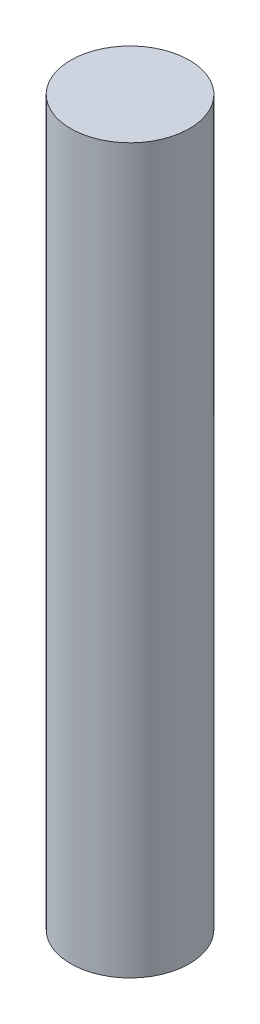
ISO-10303-21;
HEADER;
FILE_DESCRIPTION(('STEP AP214'),'2;1');
FILE_NAME('part.step','',(''),(''),'','','');
FILE_SCHEMA(('AUTOMOTIVE_DESIGN { 1 0 10303 214 1 1 1 1 }'));
ENDSEC;
DATA;
#1=APPLICATION_CONTEXT('core data for automotive mechanical design processes');
#2=APPLICATION_PROTOCOL_DEFINITION('international standard','automotive_design',2000,#1);
#3=PRODUCT_CONTEXT('',#1,'mechanical');
#4=PRODUCT('Part','Part','',(#3));
#5=PRODUCT_RELATED_PRODUCT_CATEGORY('part','',(#4));
#6=PRODUCT_DEFINITION_FORMATION('','',#4);
#7=PRODUCT_DEFINITION_CONTEXT('part definition',#1,'design');
#8=PRODUCT_DEFINITION('design','',#6,#7);
#9=PRODUCT_DEFINITION_SHAPE('','',#8);
#10=(LENGTH_UNIT() NAMED_UNIT(*) SI_UNIT(.MILLI.,.METRE.));
#11=(NAMED_UNIT(*) PLANE_ANGLE_UNIT() SI_UNIT($,.RADIAN.));
#12=(NAMED_UNIT(*) SI_UNIT($,.STERADIAN.) SOLID_ANGLE_UNIT());
#13=UNCERTAINTY_MEASURE_WITH_UNIT(LENGTH_MEASURE(1.E-05),#10,'distance_accuracy_value','');
#14=(GEOMETRIC_REPRESENTATION_CONTEXT(3) GLOBAL_UNCERTAINTY_ASSIGNED_CONTEXT((#13)) GLOBAL_UNIT_ASSIGNED_CONTEXT((#10,
#11,#12)) REPRESENTATION_CONTEXT('',''));
#15=CARTESIAN_POINT('',(0.,0.,0.));
#16=DIRECTION('',(0.,0.,1.));
#17=DIRECTION('',(1.,0.,0.));
#18=AXIS2_PLACEMENT_3D('',#15,#16,#17);
#19=CARTESIAN_POINT('',(0.,30.48,0.));
#20=DIRECTION('',(0.,-1.,0.));
#21=DIRECTION('',(0.,0.,-1.));
#22=AXIS2_PLACEMENT_3D('',#19,#20,#21);
#23=CYLINDRICAL_SURFACE('',#22,2.5);
#24=CARTESIAN_POINT('',(0.,30.48,0.));
#25=DIRECTION('',(0.,1.,0.));
#26=DIRECTION('',(0.,0.,1.));
#27=AXIS2_PLACEMENT_3D('',#24,#25,#26);
#28=CIRCLE('',#27,2.5);
#29=CARTESIAN_POINT('',(0.,30.48,-2.5));
#30=VERTEX_POINT('',#29);
#31=EDGE_CURVE('E10',#30,#30,#28,.T.);
#32=CARTESIAN_POINT('',(0.,0.,0.));
#33=DIRECTION('',(0.,1.,0.));
#34=DIRECTION('',(0.,0.,1.));
#35=AXIS2_PLACEMENT_3D('',#32,#33,#34);
#36=CIRCLE('',#35,2.5);
#37=CARTESIAN_POINT('',(0.,0.,-2.5));
#38=VERTEX_POINT('',#37);
#39=EDGE_CURVE('E45',#38,#38,#36,.T.);
#40=CARTESIAN_POINT('',(0.,30.48,-2.5));
#41=CARTESIAN_POINT('',(0.,30.1625,-2.5));
#42=CARTESIAN_POINT('',(0.,29.845,-2.5));
#43=CARTESIAN_POINT('',(0.,29.21,-2.5));
#44=CARTESIAN_POINT('',(0.,28.8925,-2.5));
#45=CARTESIAN_POINT('',(0.,28.2575,-2.5));
#46=CARTESIAN_POINT('',(0.,27.94,-2.5));
#47=CARTESIAN_POINT('',(0.,27.305,-2.5));
#48=CARTESIAN_POINT('',(0.,26.9875,-2.5));
#49=CARTESIAN_POINT('',(0.,26.3525,-2.5));
#50=CARTESIAN_POINT('',(0.,26.035,-2.5));
#51=CARTESIAN_POINT('',(0.,25.4,-2.5));
#52=CARTESIAN_POINT('',(0.,25.0825,-2.5));
#53=CARTESIAN_POINT('',(0.,24.4475,-2.5));
#54=CARTESIAN_POINT('',(0.,24.13,-2.5));
#55=CARTESIAN_POINT('',(0.,23.495,-2.5));
#56=CARTESIAN_POINT('',(0.,23.1775,-2.5));
#57=CARTESIAN_POINT('',(0.,22.5425,-2.5));
#58=CARTESIAN_POINT('',(0.,22.225,-2.5));
#59=CARTESIAN_POINT('',(0.,21.59,-2.5));
#60=CARTESIAN_POINT('',(0.,21.2725,-2.5));
#61=CARTESIAN_POINT('',(0.,20.6375,-2.5));
#62=CARTESIAN_POINT('',(0.,20.32,-2.5));
#63=CARTESIAN_POINT('',(0.,19.685,-2.5));
#64=CARTESIAN_POINT('',(0.,19.3675,-2.5));
#65=CARTESIAN_POINT('',(0.,18.7325,-2.5));
#66=CARTESIAN_POINT('',(0.,18.415,-2.5));
#67=CARTESIAN_POINT('',(0.,17.78,-2.5));
#68=CARTESIAN_POINT('',(0.,17.4625,-2.5));
#69=CARTESIAN_POINT('',(0.,16.8275,-2.5));
#70=CARTESIAN_POINT('',(0.,16.51,-2.5));
#71=CARTESIAN_POINT('',(0.,15.875,-2.5));
#72=CARTESIAN_POINT('',(0.,15.5575,-2.5));
#73=CARTESIAN_POINT('',(0.,14.9225,-2.5));
#74=CARTESIAN_POINT('',(0.,14.605,-2.5));
#75=CARTESIAN_POINT('',(0.,13.97,-2.5));
#76=CARTESIAN_POINT('',(0.,13.6525,-2.5));
#77=CARTESIAN_POINT('',(0.,13.0175,-2.5));
#78=CARTESIAN_POINT('',(0.,12.7,-2.5));
#79=CARTESIAN_POINT('',(0.,12.065,-2.5));
#80=CARTESIAN_POINT('',(0.,11.7475,-2.5));
#81=CARTESIAN_POINT('',(0.,11.1125,-2.5));
#82=CARTESIAN_POINT('',(0.,10.795,-2.5));
#83=CARTESIAN_POINT('',(0.,10.16,-2.5));
#84=CARTESIAN_POINT('',(0.,9.8425,-2.5));
#85=CARTESIAN_POINT('',(0.,9.2075,-2.5));
#86=CARTESIAN_POINT('',(0.,8.89,-2.5));
#87=CARTESIAN_POINT('',(0.,8.255,-2.5));
#88=CARTESIAN_POINT('',(0.,7.9375,-2.5));
#89=CARTESIAN_POINT('',(0.,7.3025,-2.5));
#90=CARTESIAN_POINT('',(0.,6.985,-2.5));
#91=CARTESIAN_POINT('',(0.,6.35,-2.5));
#92=CARTESIAN_POINT('',(0.,6.0325,-2.5));
#93=CARTESIAN_POINT('',(0.,5.3975,-2.5));
#94=CARTESIAN_POINT('',(0.,5.08,-2.5));
#95=CARTESIAN_POINT('',(0.,4.445,-2.5));
#96=CARTESIAN_POINT('',(0.,4.1275,-2.5));
#97=CARTESIAN_POINT('',(0.,3.4925,-2.5));
#98=CARTESIAN_POINT('',(0.,3.175,-2.5));
#99=CARTESIAN_POINT('',(0.,2.54,-2.5));
#100=CARTESIAN_POINT('',(0.,2.2225,-2.5));
#101=CARTESIAN_POINT('',(0.,1.5875,-2.5));
#102=CARTESIAN_POINT('',(0.,1.27,-2.5));
#103=CARTESIAN_POINT('',(0.,0.634999999999999,-2.5));
#104=CARTESIAN_POINT('',(0.,0.3175,-2.5));
#105=CARTESIAN_POINT('',(0.,0.,-2.5));
#106=B_SPLINE_CURVE_WITH_KNOTS('',3,(#40,#41,#42,#43,#44,#45,#46,#47,#48,#49,#50,#51,#52,#53,
#54,#55,#56,#57,#58,#59,#60,#61,#62,#63,#64,#65,#66,#67,#68,#69,#70,#71,#72,#73,#74,#75,#76,#77,
#78,#79,#80,#81,#82,#83,#84,#85,#86,#87,#88,#89,#90,#91,#92,#93,#94,#95,#96,#97,#98,#99,#100,
#101,#102,#103,#104,#105),.UNSPECIFIED.,.F.,.F.,(4,2,2,2,2,2,2,2,2,2,2,2,2,2,2,2,2,2,2,2,2,2,2,
2,2,2,2,2,2,2,2,2,4),(0.,0.952500000000002,1.905,2.8575,3.81,4.7625,5.715,6.6675,7.62,8.5725,
9.525,10.4775,11.43,12.3825,13.335,14.2875,15.24,16.1925,17.145,18.0975,19.05,20.0025,20.955,
21.9075,22.86,23.8125,24.765,25.7175,26.67,27.6225,28.575,29.5275,30.48),.UNSPECIFIED.);
#107=EDGE_CURVE('BSEAM42',#30,#38,#106,.T.);
#108=ORIENTED_EDGE('',*,*,#31,.F.);
#109=ORIENTED_EDGE('',*,*,#39,.T.);
#110=ORIENTED_EDGE('',*,*,#107,.T.);
#111=ORIENTED_EDGE('',*,*,#107,.F.);
#112=EDGE_LOOP('',(#108,#110,#109,#111));
#113=FACE_BOUND('',#112,.T.);
#114=ADVANCED_FACE('F42',(#113),#23,.T.);
#115=CARTESIAN_POINT('',(0.,30.48,0.));
#116=DIRECTION('',(0.,1.,0.));
#117=DIRECTION('',(0.,0.,1.));
#118=AXIS2_PLACEMENT_3D('',#115,#116,#117);
#119=PLANE('',#118);
#120=ORIENTED_EDGE('',*,*,#31,.T.);
#121=EDGE_LOOP('',(#120));
#122=FACE_BOUND('',#121,.T.);
#123=ADVANCED_FACE('F59',(#122),#119,.T.);
#124=CARTESIAN_POINT('',(0.,0.,0.));
#125=DIRECTION('',(0.,1.,0.));
#126=DIRECTION('',(0.,0.,1.));
#127=AXIS2_PLACEMENT_3D('',#124,#125,#126);
#128=PLANE('',#127);
#129=ORIENTED_EDGE('',*,*,#39,.F.);
#130=EDGE_LOOP('',(#129));
#131=FACE_BOUND('',#130,.T.);
#132=ADVANCED_FACE('F57',(#131),#128,.F.);
#133=CLOSED_SHELL('',(#114,#123,#132));
#134=MANIFOLD_SOLID_BREP('B2',#133);
#135=ADVANCED_BREP_SHAPE_REPRESENTATION('',(#18,#134),#14);
#136=SHAPE_DEFINITION_REPRESENTATION(#9,#135);
ENDSEC;
END-ISO-10303-21;
